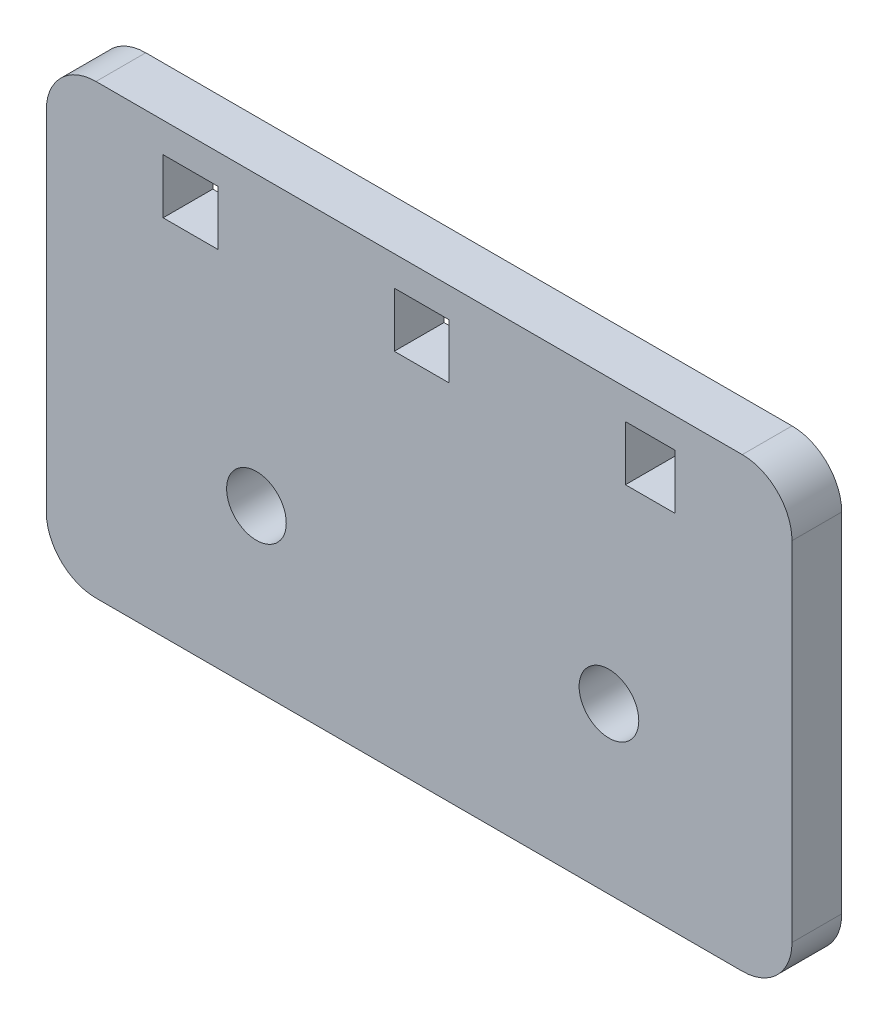
ISO-10303-21;
HEADER;
FILE_DESCRIPTION(('STEP AP214'),'2;1');
FILE_NAME('part.step','',(''),(''),'','','');
FILE_SCHEMA(('AUTOMOTIVE_DESIGN { 1 0 10303 214 1 1 1 1 }'));
ENDSEC;
DATA;
#1=APPLICATION_CONTEXT('core data for automotive mechanical design processes');
#2=APPLICATION_PROTOCOL_DEFINITION('international standard','automotive_design',2000,#1);
#3=PRODUCT_CONTEXT('',#1,'mechanical');
#4=PRODUCT('Part','Part','',(#3));
#5=PRODUCT_RELATED_PRODUCT_CATEGORY('part','',(#4));
#6=PRODUCT_DEFINITION_FORMATION('','',#4);
#7=PRODUCT_DEFINITION_CONTEXT('part definition',#1,'design');
#8=PRODUCT_DEFINITION('design','',#6,#7);
#9=PRODUCT_DEFINITION_SHAPE('','',#8);
#10=(LENGTH_UNIT() NAMED_UNIT(*) SI_UNIT(.MILLI.,.METRE.));
#11=(NAMED_UNIT(*) PLANE_ANGLE_UNIT() SI_UNIT($,.RADIAN.));
#12=(NAMED_UNIT(*) SI_UNIT($,.STERADIAN.) SOLID_ANGLE_UNIT());
#13=UNCERTAINTY_MEASURE_WITH_UNIT(LENGTH_MEASURE(1.E-05),#10,'distance_accuracy_value','');
#14=(GEOMETRIC_REPRESENTATION_CONTEXT(3) GLOBAL_UNCERTAINTY_ASSIGNED_CONTEXT((#13)) GLOBAL_UNIT_ASSIGNED_CONTEXT((#10,
#11,#12)) REPRESENTATION_CONTEXT('',''));
#15=CARTESIAN_POINT('',(0.,0.,0.));
#16=DIRECTION('',(0.,0.,1.));
#17=DIRECTION('',(1.,0.,0.));
#18=AXIS2_PLACEMENT_3D('',#15,#16,#17);
#19=CARTESIAN_POINT('',(0.,0.,5.));
#20=DIRECTION('',(0.,0.,1.));
#21=DIRECTION('',(1.,0.,0.));
#22=AXIS2_PLACEMENT_3D('',#19,#20,#21);
#23=PLANE('',#22);
#24=DIRECTION('',(0.,-1.,0.));
#25=VECTOR('',#24,1.);
#26=CARTESIAN_POINT('',(58.25,0.,5.));
#27=LINE('',#26,#25);
#28=CARTESIAN_POINT('',(58.25,-3.,5.));
#29=VERTEX_POINT('',#28);
#30=CARTESIAN_POINT('',(58.25,-8.49999999999999,5.));
#31=VERTEX_POINT('',#30);
#32=EDGE_CURVE('E186',#29,#31,#27,.T.);
#33=ORIENTED_EDGE('',*,*,#32,.F.);
#34=DIRECTION('',(-1.,0.,0.));
#35=VECTOR('',#34,1.);
#36=CARTESIAN_POINT('',(0.,-3.,5.));
#37=LINE('',#36,#35);
#38=CARTESIAN_POINT('',(63.25,-3.,5.));
#39=VERTEX_POINT('',#38);
#40=EDGE_CURVE('E207',#39,#29,#37,.T.);
#41=ORIENTED_EDGE('',*,*,#40,.F.);
#42=DIRECTION('',(0.,1.,0.));
#43=VECTOR('',#42,1.);
#44=CARTESIAN_POINT('',(63.25,0.,5.));
#45=LINE('',#44,#43);
#46=CARTESIAN_POINT('',(63.25,-8.49999999999999,5.));
#47=VERTEX_POINT('',#46);
#48=EDGE_CURVE('E206',#47,#39,#45,.T.);
#49=ORIENTED_EDGE('',*,*,#48,.F.);
#50=DIRECTION('',(1.,0.,0.));
#51=VECTOR('',#50,1.);
#52=CARTESIAN_POINT('',(0.,-8.50000000000001,5.));
#53=LINE('',#52,#51);
#54=EDGE_CURVE('E213',#31,#47,#53,.T.);
#55=ORIENTED_EDGE('',*,*,#54,.F.);
#56=EDGE_LOOP('',(#33,#41,#49,#55));
#57=FACE_BOUND('',#56,.T.);
#58=DIRECTION('',(0.,1.,0.));
#59=VECTOR('',#58,1.);
#60=CARTESIAN_POINT('',(40.5,0.,5.));
#61=LINE('',#60,#59);
#62=CARTESIAN_POINT('',(40.5,-8.5,5.));
#63=VERTEX_POINT('',#62);
#64=CARTESIAN_POINT('',(40.5,-3.,5.));
#65=VERTEX_POINT('',#64);
#66=EDGE_CURVE('E221',#63,#65,#61,.T.);
#67=ORIENTED_EDGE('',*,*,#66,.F.);
#68=DIRECTION('',(1.,0.,0.));
#69=VECTOR('',#68,1.);
#70=CARTESIAN_POINT('',(0.,-8.49999999999999,5.));
#71=LINE('',#70,#69);
#72=CARTESIAN_POINT('',(35.,-8.5,5.));
#73=VERTEX_POINT('',#72);
#74=EDGE_CURVE('E259',#73,#63,#71,.T.);
#75=ORIENTED_EDGE('',*,*,#74,.F.);
#76=DIRECTION('',(0.,-1.,0.));
#77=VECTOR('',#76,1.);
#78=CARTESIAN_POINT('',(35.,0.,5.));
#79=LINE('',#78,#77);
#80=CARTESIAN_POINT('',(35.,-3.,5.));
#81=VERTEX_POINT('',#80);
#82=EDGE_CURVE('E272',#81,#73,#79,.T.);
#83=ORIENTED_EDGE('',*,*,#82,.F.);
#84=DIRECTION('',(-1.,0.,0.));
#85=VECTOR('',#84,1.);
#86=CARTESIAN_POINT('',(0.,-3.,5.));
#87=LINE('',#86,#85);
#88=EDGE_CURVE('E271',#65,#81,#87,.T.);
#89=ORIENTED_EDGE('',*,*,#88,.F.);
#90=EDGE_LOOP('',(#67,#75,#83,#89));
#91=FACE_BOUND('',#90,.T.);
#92=CARTESIAN_POINT('',(21.1350000104374,-28.9000000045357,5.));
#93=DIRECTION('',(0.,0.,1.));
#94=DIRECTION('',(1.,0.,0.));
#95=AXIS2_PLACEMENT_3D('',#92,#93,#94);
#96=CIRCLE('',#95,3.00000000000001);
#97=CARTESIAN_POINT('',(24.1350000104374,-28.9000000045357,5.));
#98=VERTEX_POINT('',#97);
#99=EDGE_CURVE('E291',#98,#98,#96,.T.);
#100=ORIENTED_EDGE('',*,*,#99,.F.);
#101=EDGE_LOOP('',(#100));
#102=FACE_BOUND('',#101,.T.);
#103=DIRECTION('',(0.,-1.,0.));
#104=VECTOR('',#103,1.);
#105=CARTESIAN_POINT('',(0.,0.,5.));
#106=LINE('',#105,#104);
#107=CARTESIAN_POINT('',(0.,-5.,5.));
#108=VERTEX_POINT('',#107);
#109=CARTESIAN_POINT('',(0.,-40.,5.));
#110=VERTEX_POINT('',#109);
#111=EDGE_CURVE('E297',#108,#110,#106,.T.);
#112=ORIENTED_EDGE('',*,*,#111,.T.);
#113=CARTESIAN_POINT('',(5.00000000000001,-40.,5.));
#114=DIRECTION('',(0.,0.,1.));
#115=DIRECTION('',(1.,0.,0.));
#116=AXIS2_PLACEMENT_3D('',#113,#114,#115);
#117=CIRCLE('',#116,5.);
#118=CARTESIAN_POINT('',(5.00000000000001,-45.,5.));
#119=VERTEX_POINT('',#118);
#120=EDGE_CURVE('E343',#110,#119,#117,.T.);
#121=ORIENTED_EDGE('',*,*,#120,.T.);
#122=DIRECTION('',(1.,0.,0.));
#123=VECTOR('',#122,1.);
#124=CARTESIAN_POINT('',(0.,-45.,5.));
#125=LINE('',#124,#123);
#126=CARTESIAN_POINT('',(70.,-45.,5.));
#127=VERTEX_POINT('',#126);
#128=EDGE_CURVE('E305',#119,#127,#125,.T.);
#129=ORIENTED_EDGE('',*,*,#128,.T.);
#130=CARTESIAN_POINT('',(70.,-40.,5.));
#131=DIRECTION('',(0.,0.,1.));
#132=DIRECTION('',(1.,0.,0.));
#133=AXIS2_PLACEMENT_3D('',#130,#131,#132);
#134=CIRCLE('',#133,5.);
#135=CARTESIAN_POINT('',(75.,-40.,5.));
#136=VERTEX_POINT('',#135);
#137=EDGE_CURVE('E341',#127,#136,#134,.T.);
#138=ORIENTED_EDGE('',*,*,#137,.T.);
#139=DIRECTION('',(0.,1.,0.));
#140=VECTOR('',#139,1.);
#141=CARTESIAN_POINT('',(75.,0.,5.));
#142=LINE('',#141,#140);
#143=CARTESIAN_POINT('',(75.,-5.,5.));
#144=VERTEX_POINT('',#143);
#145=EDGE_CURVE('E310',#136,#144,#142,.T.);
#146=ORIENTED_EDGE('',*,*,#145,.T.);
#147=CARTESIAN_POINT('',(70.,-5.,5.));
#148=DIRECTION('',(0.,0.,1.));
#149=DIRECTION('',(1.,0.,0.));
#150=AXIS2_PLACEMENT_3D('',#147,#148,#149);
#151=CIRCLE('',#150,5.);
#152=CARTESIAN_POINT('',(70.,0.,5.));
#153=VERTEX_POINT('',#152);
#154=EDGE_CURVE('E61',#144,#153,#151,.T.);
#155=ORIENTED_EDGE('',*,*,#154,.T.);
#156=DIRECTION('',(-1.,0.,0.));
#157=VECTOR('',#156,1.);
#158=CARTESIAN_POINT('',(0.,0.,5.));
#159=LINE('',#158,#157);
#160=CARTESIAN_POINT('',(5.,0.,5.));
#161=VERTEX_POINT('',#160);
#162=EDGE_CURVE('E309',#153,#161,#159,.T.);
#163=ORIENTED_EDGE('',*,*,#162,.T.);
#164=CARTESIAN_POINT('',(5.,-5.,5.));
#165=DIRECTION('',(0.,0.,1.));
#166=DIRECTION('',(1.,0.,0.));
#167=AXIS2_PLACEMENT_3D('',#164,#165,#166);
#168=CIRCLE('',#167,5.);
#169=EDGE_CURVE('E336',#161,#108,#168,.T.);
#170=ORIENTED_EDGE('',*,*,#169,.T.);
#171=EDGE_LOOP('',(#112,#121,#129,#138,#146,#155,#163,#170));
#172=FACE_BOUND('',#171,.T.);
#173=CARTESIAN_POINT('',(56.5900000000001,-28.3999999999999,5.));
#174=DIRECTION('',(0.,0.,1.));
#175=DIRECTION('',(1.,0.,0.));
#176=AXIS2_PLACEMENT_3D('',#173,#174,#175);
#177=CIRCLE('',#176,3.00000000001641);
#178=CARTESIAN_POINT('',(59.5900000000165,-28.3999999999999,5.));
#179=VERTEX_POINT('',#178);
#180=EDGE_CURVE('E289',#179,#179,#177,.T.);
#181=ORIENTED_EDGE('',*,*,#180,.F.);
#182=EDGE_LOOP('',(#181));
#183=FACE_BOUND('',#182,.T.);
#184=DIRECTION('',(0.,-1.,0.));
#185=VECTOR('',#184,1.);
#186=CARTESIAN_POINT('',(17.25,0.,5.));
#187=LINE('',#186,#185);
#188=CARTESIAN_POINT('',(17.25,-3.,5.));
#189=VERTEX_POINT('',#188);
#190=CARTESIAN_POINT('',(17.25,-8.5,5.));
#191=VERTEX_POINT('',#190);
#192=EDGE_CURVE('E238',#189,#191,#187,.T.);
#193=ORIENTED_EDGE('',*,*,#192,.T.);
#194=DIRECTION('',(-1.,0.,0.));
#195=VECTOR('',#194,1.);
#196=CARTESIAN_POINT('',(0.,-8.5,5.));
#197=LINE('',#196,#195);
#198=CARTESIAN_POINT('',(11.75,-8.5,5.));
#199=VERTEX_POINT('',#198);
#200=EDGE_CURVE('E240',#191,#199,#197,.T.);
#201=ORIENTED_EDGE('',*,*,#200,.T.);
#202=DIRECTION('',(0.,1.,0.));
#203=VECTOR('',#202,1.);
#204=CARTESIAN_POINT('',(11.75,0.,5.));
#205=LINE('',#204,#203);
#206=CARTESIAN_POINT('',(11.75,-3.,5.));
#207=VERTEX_POINT('',#206);
#208=EDGE_CURVE('E228',#199,#207,#205,.T.);
#209=ORIENTED_EDGE('',*,*,#208,.T.);
#210=DIRECTION('',(1.,0.,0.));
#211=VECTOR('',#210,1.);
#212=CARTESIAN_POINT('',(0.,-3.,5.));
#213=LINE('',#212,#211);
#214=EDGE_CURVE('E244',#207,#189,#213,.T.);
#215=ORIENTED_EDGE('',*,*,#214,.T.);
#216=EDGE_LOOP('',(#193,#201,#209,#215));
#217=FACE_BOUND('',#216,.T.);
#218=ADVANCED_FACE('F43',(#57,#91,#102,#172,#183,#217),#23,.T.);
#219=CARTESIAN_POINT('',(0.,0.,0.));
#220=DIRECTION('',(0.,0.,1.));
#221=DIRECTION('',(1.,0.,0.));
#222=AXIS2_PLACEMENT_3D('',#219,#220,#221);
#223=PLANE('',#222);
#224=CARTESIAN_POINT('',(56.5900000000001,-28.3999999999999,0.));
#225=DIRECTION('',(0.,0.,1.));
#226=DIRECTION('',(1.,0.,0.));
#227=AXIS2_PLACEMENT_3D('',#224,#225,#226);
#228=CIRCLE('',#227,3.00000000001641);
#229=CARTESIAN_POINT('',(59.5900000000165,-28.3999999999999,0.));
#230=VERTEX_POINT('',#229);
#231=EDGE_CURVE('E282',#230,#230,#228,.T.);
#232=ORIENTED_EDGE('',*,*,#231,.T.);
#233=EDGE_LOOP('',(#232));
#234=FACE_BOUND('',#233,.T.);
#235=CARTESIAN_POINT('',(21.1350000104374,-28.9000000045357,0.));
#236=DIRECTION('',(0.,0.,1.));
#237=DIRECTION('',(1.,0.,0.));
#238=AXIS2_PLACEMENT_3D('',#235,#236,#237);
#239=CIRCLE('',#238,3.00000000000001);
#240=CARTESIAN_POINT('',(24.1350000104374,-28.9000000045357,0.));
#241=VERTEX_POINT('',#240);
#242=EDGE_CURVE('E292',#241,#241,#239,.T.);
#243=ORIENTED_EDGE('',*,*,#242,.T.);
#244=EDGE_LOOP('',(#243));
#245=FACE_BOUND('',#244,.T.);
#246=DIRECTION('',(1.,0.,0.));
#247=VECTOR('',#246,1.);
#248=CARTESIAN_POINT('',(0.,-45.,0.));
#249=LINE('',#248,#247);
#250=CARTESIAN_POINT('',(5.00000000000001,-45.,0.));
#251=VERTEX_POINT('',#250);
#252=CARTESIAN_POINT('',(70.,-45.,0.));
#253=VERTEX_POINT('',#252);
#254=EDGE_CURVE('E311',#251,#253,#249,.T.);
#255=ORIENTED_EDGE('',*,*,#254,.F.);
#256=CARTESIAN_POINT('',(5.00000000000001,-40.,0.));
#257=DIRECTION('',(0.,0.,1.));
#258=DIRECTION('',(1.,0.,0.));
#259=AXIS2_PLACEMENT_3D('',#256,#257,#258);
#260=CIRCLE('',#259,5.);
#261=CARTESIAN_POINT('',(0.,-40.,0.));
#262=VERTEX_POINT('',#261);
#263=EDGE_CURVE('E333',#251,#262,#260,.F.);
#264=ORIENTED_EDGE('',*,*,#263,.T.);
#265=DIRECTION('',(0.,-1.,0.));
#266=VECTOR('',#265,1.);
#267=CARTESIAN_POINT('',(0.,0.,0.));
#268=LINE('',#267,#266);
#269=CARTESIAN_POINT('',(0.,-5.,0.));
#270=VERTEX_POINT('',#269);
#271=EDGE_CURVE('E296',#270,#262,#268,.T.);
#272=ORIENTED_EDGE('',*,*,#271,.F.);
#273=CARTESIAN_POINT('',(5.,-5.,0.));
#274=DIRECTION('',(0.,0.,1.));
#275=DIRECTION('',(1.,0.,0.));
#276=AXIS2_PLACEMENT_3D('',#273,#274,#275);
#277=CIRCLE('',#276,5.);
#278=CARTESIAN_POINT('',(5.,0.,0.));
#279=VERTEX_POINT('',#278);
#280=EDGE_CURVE('E322',#270,#279,#277,.F.);
#281=ORIENTED_EDGE('',*,*,#280,.T.);
#282=DIRECTION('',(-1.,0.,0.));
#283=VECTOR('',#282,1.);
#284=CARTESIAN_POINT('',(0.,0.,0.));
#285=LINE('',#284,#283);
#286=CARTESIAN_POINT('',(70.,0.,0.));
#287=VERTEX_POINT('',#286);
#288=EDGE_CURVE('E303',#287,#279,#285,.T.);
#289=ORIENTED_EDGE('',*,*,#288,.F.);
#290=CARTESIAN_POINT('',(70.,-5.,0.));
#291=DIRECTION('',(0.,0.,1.));
#292=DIRECTION('',(1.,0.,0.));
#293=AXIS2_PLACEMENT_3D('',#290,#291,#292);
#294=CIRCLE('',#293,5.);
#295=CARTESIAN_POINT('',(75.,-5.,0.));
#296=VERTEX_POINT('',#295);
#297=EDGE_CURVE('E326',#287,#296,#294,.F.);
#298=ORIENTED_EDGE('',*,*,#297,.T.);
#299=DIRECTION('',(0.,1.,0.));
#300=VECTOR('',#299,1.);
#301=CARTESIAN_POINT('',(75.,0.,0.));
#302=LINE('',#301,#300);
#303=CARTESIAN_POINT('',(75.,-40.,0.));
#304=VERTEX_POINT('',#303);
#305=EDGE_CURVE('E320',#304,#296,#302,.T.);
#306=ORIENTED_EDGE('',*,*,#305,.F.);
#307=CARTESIAN_POINT('',(70.,-40.,0.));
#308=DIRECTION('',(0.,0.,1.));
#309=DIRECTION('',(1.,0.,0.));
#310=AXIS2_PLACEMENT_3D('',#307,#308,#309);
#311=CIRCLE('',#310,5.);
#312=EDGE_CURVE('E328',#304,#253,#311,.F.);
#313=ORIENTED_EDGE('',*,*,#312,.T.);
#314=EDGE_LOOP('',(#255,#264,#272,#281,#289,#298,#306,#313));
#315=FACE_BOUND('',#314,.T.);
#316=DIRECTION('',(1.,0.,0.));
#317=VECTOR('',#316,1.);
#318=CARTESIAN_POINT('',(0.,-8.49999999999999,0.));
#319=LINE('',#318,#317);
#320=CARTESIAN_POINT('',(35.,-8.5,0.));
#321=VERTEX_POINT('',#320);
#322=CARTESIAN_POINT('',(40.5,-8.5,0.));
#323=VERTEX_POINT('',#322);
#324=EDGE_CURVE('E266',#321,#323,#319,.T.);
#325=ORIENTED_EDGE('',*,*,#324,.T.);
#326=DIRECTION('',(0.,1.,0.));
#327=VECTOR('',#326,1.);
#328=CARTESIAN_POINT('',(40.5,0.,0.));
#329=LINE('',#328,#327);
#330=CARTESIAN_POINT('',(40.5,-3.,0.));
#331=VERTEX_POINT('',#330);
#332=EDGE_CURVE('E258',#323,#331,#329,.T.);
#333=ORIENTED_EDGE('',*,*,#332,.T.);
#334=DIRECTION('',(-1.,0.,0.));
#335=VECTOR('',#334,1.);
#336=CARTESIAN_POINT('',(0.,-3.,0.));
#337=LINE('',#336,#335);
#338=CARTESIAN_POINT('',(35.,-3.,0.));
#339=VERTEX_POINT('',#338);
#340=EDGE_CURVE('E260',#331,#339,#337,.T.);
#341=ORIENTED_EDGE('',*,*,#340,.T.);
#342=DIRECTION('',(0.,-1.,0.));
#343=VECTOR('',#342,1.);
#344=CARTESIAN_POINT('',(35.,0.,0.));
#345=LINE('',#344,#343);
#346=EDGE_CURVE('E261',#339,#321,#345,.T.);
#347=ORIENTED_EDGE('',*,*,#346,.T.);
#348=EDGE_LOOP('',(#325,#333,#341,#347));
#349=FACE_BOUND('',#348,.T.);
#350=DIRECTION('',(-1.,0.,0.));
#351=VECTOR('',#350,1.);
#352=CARTESIAN_POINT('',(0.,-3.,0.));
#353=LINE('',#352,#351);
#354=CARTESIAN_POINT('',(63.25,-3.,0.));
#355=VERTEX_POINT('',#354);
#356=CARTESIAN_POINT('',(58.25,-3.,0.));
#357=VERTEX_POINT('',#356);
#358=EDGE_CURVE('E193',#355,#357,#353,.T.);
#359=ORIENTED_EDGE('',*,*,#358,.T.);
#360=DIRECTION('',(0.,-1.,0.));
#361=VECTOR('',#360,1.);
#362=CARTESIAN_POINT('',(58.25,0.,0.));
#363=LINE('',#362,#361);
#364=CARTESIAN_POINT('',(58.25,-8.49999999999999,0.));
#365=VERTEX_POINT('',#364);
#366=EDGE_CURVE('E184',#357,#365,#363,.T.);
#367=ORIENTED_EDGE('',*,*,#366,.T.);
#368=DIRECTION('',(1.,0.,0.));
#369=VECTOR('',#368,1.);
#370=CARTESIAN_POINT('',(0.,-8.50000000000001,0.));
#371=LINE('',#370,#369);
#372=CARTESIAN_POINT('',(63.25,-8.49999999999999,0.));
#373=VERTEX_POINT('',#372);
#374=EDGE_CURVE('E200',#365,#373,#371,.T.);
#375=ORIENTED_EDGE('',*,*,#374,.T.);
#376=DIRECTION('',(0.,1.,0.));
#377=VECTOR('',#376,1.);
#378=CARTESIAN_POINT('',(63.25,0.,0.));
#379=LINE('',#378,#377);
#380=EDGE_CURVE('E201',#373,#355,#379,.T.);
#381=ORIENTED_EDGE('',*,*,#380,.T.);
#382=EDGE_LOOP('',(#359,#367,#375,#381));
#383=FACE_BOUND('',#382,.T.);
#384=DIRECTION('',(-1.,0.,0.));
#385=VECTOR('',#384,1.);
#386=CARTESIAN_POINT('',(0.,-8.5,0.));
#387=LINE('',#386,#385);
#388=CARTESIAN_POINT('',(17.25,-8.5,0.));
#389=VERTEX_POINT('',#388);
#390=CARTESIAN_POINT('',(11.75,-8.5,0.));
#391=VERTEX_POINT('',#390);
#392=EDGE_CURVE('E229',#389,#391,#387,.T.);
#393=ORIENTED_EDGE('',*,*,#392,.F.);
#394=DIRECTION('',(0.,-1.,0.));
#395=VECTOR('',#394,1.);
#396=CARTESIAN_POINT('',(17.25,0.,0.));
#397=LINE('',#396,#395);
#398=CARTESIAN_POINT('',(17.25,-3.,0.));
#399=VERTEX_POINT('',#398);
#400=EDGE_CURVE('E230',#399,#389,#397,.T.);
#401=ORIENTED_EDGE('',*,*,#400,.F.);
#402=DIRECTION('',(1.,0.,0.));
#403=VECTOR('',#402,1.);
#404=CARTESIAN_POINT('',(0.,-3.,0.));
#405=LINE('',#404,#403);
#406=CARTESIAN_POINT('',(11.75,-3.,0.));
#407=VERTEX_POINT('',#406);
#408=EDGE_CURVE('E232',#407,#399,#405,.T.);
#409=ORIENTED_EDGE('',*,*,#408,.F.);
#410=DIRECTION('',(0.,1.,0.));
#411=VECTOR('',#410,1.);
#412=CARTESIAN_POINT('',(11.75,0.,0.));
#413=LINE('',#412,#411);
#414=EDGE_CURVE('E234',#391,#407,#413,.T.);
#415=ORIENTED_EDGE('',*,*,#414,.F.);
#416=EDGE_LOOP('',(#393,#401,#409,#415));
#417=FACE_BOUND('',#416,.T.);
#418=ADVANCED_FACE('F202',(#234,#245,#315,#349,#383,#417),#223,.F.);
#419=CARTESIAN_POINT('',(0.,0.,5.));
#420=DIRECTION('',(1.,0.,0.));
#421=DIRECTION('',(0.,1.,0.));
#422=AXIS2_PLACEMENT_3D('',#419,#420,#421);
#423=PLANE('',#422);
#424=ORIENTED_EDGE('',*,*,#271,.T.);
#425=DIRECTION('',(0.,0.,-1.));
#426=VECTOR('',#425,1.);
#427=CARTESIAN_POINT('',(0.,-40.,5.));
#428=LINE('',#427,#426);
#429=EDGE_CURVE('E338',#262,#110,#428,.F.);
#430=ORIENTED_EDGE('',*,*,#429,.T.);
#431=ORIENTED_EDGE('',*,*,#111,.F.);
#432=DIRECTION('',(0.,0.,-1.));
#433=VECTOR('',#432,1.);
#434=CARTESIAN_POINT('',(0.,-5.,5.));
#435=LINE('',#434,#433);
#436=EDGE_CURVE('E331',#108,#270,#435,.T.);
#437=ORIENTED_EDGE('',*,*,#436,.T.);
#438=EDGE_LOOP('',(#424,#430,#431,#437));
#439=FACE_BOUND('',#438,.T.);
#440=ADVANCED_FACE('F371',(#439),#423,.F.);
#441=CARTESIAN_POINT('',(0.,-45.,5.));
#442=DIRECTION('',(0.,1.,0.));
#443=DIRECTION('',(0.,0.,1.));
#444=AXIS2_PLACEMENT_3D('',#441,#442,#443);
#445=PLANE('',#444);
#446=ORIENTED_EDGE('',*,*,#128,.F.);
#447=DIRECTION('',(0.,0.,-1.));
#448=VECTOR('',#447,1.);
#449=CARTESIAN_POINT('',(5.00000000000001,-45.,5.));
#450=LINE('',#449,#448);
#451=EDGE_CURVE('E321',#119,#251,#450,.T.);
#452=ORIENTED_EDGE('',*,*,#451,.T.);
#453=ORIENTED_EDGE('',*,*,#254,.T.);
#454=DIRECTION('',(0.,0.,-1.));
#455=VECTOR('',#454,1.);
#456=CARTESIAN_POINT('',(70.,-45.,5.));
#457=LINE('',#456,#455);
#458=EDGE_CURVE('E312',#253,#127,#457,.F.);
#459=ORIENTED_EDGE('',*,*,#458,.T.);
#460=EDGE_LOOP('',(#446,#452,#453,#459));
#461=FACE_BOUND('',#460,.T.);
#462=ADVANCED_FACE('F377',(#461),#445,.F.);
#463=CARTESIAN_POINT('',(75.,0.,5.));
#464=DIRECTION('',(-1.,0.,0.));
#465=DIRECTION('',(0.,0.,1.));
#466=AXIS2_PLACEMENT_3D('',#463,#464,#465);
#467=PLANE('',#466);
#468=ORIENTED_EDGE('',*,*,#145,.F.);
#469=DIRECTION('',(0.,0.,-1.));
#470=VECTOR('',#469,1.);
#471=CARTESIAN_POINT('',(75.,-40.,5.));
#472=LINE('',#471,#470);
#473=EDGE_CURVE('E350',#136,#304,#472,.T.);
#474=ORIENTED_EDGE('',*,*,#473,.T.);
#475=ORIENTED_EDGE('',*,*,#305,.T.);
#476=DIRECTION('',(0.,0.,-1.));
#477=VECTOR('',#476,1.);
#478=CARTESIAN_POINT('',(75.,-5.,5.));
#479=LINE('',#478,#477);
#480=EDGE_CURVE('E344',#296,#144,#479,.F.);
#481=ORIENTED_EDGE('',*,*,#480,.T.);
#482=EDGE_LOOP('',(#468,#474,#475,#481));
#483=FACE_BOUND('',#482,.T.);
#484=ADVANCED_FACE('F352',(#483),#467,.F.);
#485=CARTESIAN_POINT('',(0.,0.,5.));
#486=DIRECTION('',(0.,-1.,0.));
#487=DIRECTION('',(0.,0.,-1.));
#488=AXIS2_PLACEMENT_3D('',#485,#486,#487);
#489=PLANE('',#488);
#490=ORIENTED_EDGE('',*,*,#162,.F.);
#491=DIRECTION('',(0.,0.,-1.));
#492=VECTOR('',#491,1.);
#493=CARTESIAN_POINT('',(70.,0.,5.));
#494=LINE('',#493,#492);
#495=EDGE_CURVE('E11',#153,#287,#494,.T.);
#496=ORIENTED_EDGE('',*,*,#495,.T.);
#497=ORIENTED_EDGE('',*,*,#288,.T.);
#498=DIRECTION('',(0.,0.,-1.));
#499=VECTOR('',#498,1.);
#500=CARTESIAN_POINT('',(5.,0.,5.));
#501=LINE('',#500,#499);
#502=EDGE_CURVE('E51',#279,#161,#501,.F.);
#503=ORIENTED_EDGE('',*,*,#502,.T.);
#504=EDGE_LOOP('',(#490,#496,#497,#503));
#505=FACE_BOUND('',#504,.T.);
#506=ADVANCED_FACE('F361',(#505),#489,.F.);
#507=CARTESIAN_POINT('',(21.1350000104374,-28.9000000045357,5.));
#508=DIRECTION('',(0.,0.,-1.));
#509=DIRECTION('',(-1.,0.,0.));
#510=AXIS2_PLACEMENT_3D('',#507,#508,#509);
#511=CYLINDRICAL_SURFACE('',#510,3.00000000000001);
#512=ORIENTED_EDGE('',*,*,#99,.T.);
#513=EDGE_LOOP('',(#512));
#514=FACE_BOUND('',#513,.T.);
#515=ORIENTED_EDGE('',*,*,#242,.F.);
#516=EDGE_LOOP('',(#515));
#517=FACE_BOUND('',#516,.T.);
#518=ADVANCED_FACE('F405',(#514,#517),#511,.F.);
#519=CARTESIAN_POINT('',(56.5900000000001,-28.3999999999999,5.));
#520=DIRECTION('',(0.,0.,-1.));
#521=DIRECTION('',(-1.,0.,0.));
#522=AXIS2_PLACEMENT_3D('',#519,#520,#521);
#523=CYLINDRICAL_SURFACE('',#522,3.00000000001641);
#524=ORIENTED_EDGE('',*,*,#180,.T.);
#525=EDGE_LOOP('',(#524));
#526=FACE_BOUND('',#525,.T.);
#527=ORIENTED_EDGE('',*,*,#231,.F.);
#528=EDGE_LOOP('',(#527));
#529=FACE_BOUND('',#528,.T.);
#530=ADVANCED_FACE('F568',(#526,#529),#523,.F.);
#531=CARTESIAN_POINT('',(40.5,0.,0.));
#532=DIRECTION('',(1.,0.,0.));
#533=DIRECTION('',(0.,0.,-1.));
#534=AXIS2_PLACEMENT_3D('',#531,#532,#533);
#535=PLANE('',#534);
#536=ORIENTED_EDGE('',*,*,#66,.T.);
#537=DIRECTION('',(0.,0.,1.));
#538=VECTOR('',#537,1.);
#539=CARTESIAN_POINT('',(40.5,-3.,0.));
#540=LINE('',#539,#538);
#541=EDGE_CURVE('E267',#331,#65,#540,.T.);
#542=ORIENTED_EDGE('',*,*,#541,.F.);
#543=ORIENTED_EDGE('',*,*,#332,.F.);
#544=DIRECTION('',(0.,0.,1.));
#545=VECTOR('',#544,1.);
#546=CARTESIAN_POINT('',(40.5,-8.5,0.));
#547=LINE('',#546,#545);
#548=EDGE_CURVE('E278',#323,#63,#547,.T.);
#549=ORIENTED_EDGE('',*,*,#548,.T.);
#550=EDGE_LOOP('',(#536,#542,#543,#549));
#551=FACE_BOUND('',#550,.T.);
#552=ADVANCED_FACE('F560',(#551),#535,.F.);
#553=CARTESIAN_POINT('',(0.,-8.49999999999999,0.));
#554=DIRECTION('',(0.,-1.,0.));
#555=DIRECTION('',(1.,0.,0.));
#556=AXIS2_PLACEMENT_3D('',#553,#554,#555);
#557=PLANE('',#556);
#558=ORIENTED_EDGE('',*,*,#74,.T.);
#559=ORIENTED_EDGE('',*,*,#548,.F.);
#560=ORIENTED_EDGE('',*,*,#324,.F.);
#561=DIRECTION('',(0.,0.,1.));
#562=VECTOR('',#561,1.);
#563=CARTESIAN_POINT('',(35.,-8.5,0.));
#564=LINE('',#563,#562);
#565=EDGE_CURVE('E285',#321,#73,#564,.T.);
#566=ORIENTED_EDGE('',*,*,#565,.T.);
#567=EDGE_LOOP('',(#558,#559,#560,#566));
#568=FACE_BOUND('',#567,.T.);
#569=ADVANCED_FACE('F547',(#568),#557,.F.);
#570=CARTESIAN_POINT('',(35.,0.,0.));
#571=DIRECTION('',(-1.,0.,0.));
#572=DIRECTION('',(0.,0.,1.));
#573=AXIS2_PLACEMENT_3D('',#570,#571,#572);
#574=PLANE('',#573);
#575=ORIENTED_EDGE('',*,*,#82,.T.);
#576=ORIENTED_EDGE('',*,*,#565,.F.);
#577=ORIENTED_EDGE('',*,*,#346,.F.);
#578=DIRECTION('',(0.,0.,1.));
#579=VECTOR('',#578,1.);
#580=CARTESIAN_POINT('',(35.,-3.,0.));
#581=LINE('',#580,#579);
#582=EDGE_CURVE('E281',#339,#81,#581,.T.);
#583=ORIENTED_EDGE('',*,*,#582,.T.);
#584=EDGE_LOOP('',(#575,#576,#577,#583));
#585=FACE_BOUND('',#584,.T.);
#586=ADVANCED_FACE('F538',(#585),#574,.F.);
#587=CARTESIAN_POINT('',(0.,-3.,0.));
#588=DIRECTION('',(0.,1.,0.));
#589=DIRECTION('',(0.,0.,1.));
#590=AXIS2_PLACEMENT_3D('',#587,#588,#589);
#591=PLANE('',#590);
#592=ORIENTED_EDGE('',*,*,#88,.T.);
#593=ORIENTED_EDGE('',*,*,#582,.F.);
#594=ORIENTED_EDGE('',*,*,#340,.F.);
#595=ORIENTED_EDGE('',*,*,#541,.T.);
#596=EDGE_LOOP('',(#592,#593,#594,#595));
#597=FACE_BOUND('',#596,.T.);
#598=ADVANCED_FACE('F532',(#597),#591,.F.);
#599=CARTESIAN_POINT('',(58.25,0.,0.));
#600=DIRECTION('',(-1.,0.,0.));
#601=DIRECTION('',(0.,0.,1.));
#602=AXIS2_PLACEMENT_3D('',#599,#600,#601);
#603=PLANE('',#602);
#604=ORIENTED_EDGE('',*,*,#32,.T.);
#605=DIRECTION('',(0.,0.,1.));
#606=VECTOR('',#605,1.);
#607=CARTESIAN_POINT('',(58.25,-8.49999999999999,0.));
#608=LINE('',#607,#606);
#609=EDGE_CURVE('E183',#365,#31,#608,.T.);
#610=ORIENTED_EDGE('',*,*,#609,.F.);
#611=ORIENTED_EDGE('',*,*,#366,.F.);
#612=DIRECTION('',(0.,0.,1.));
#613=VECTOR('',#612,1.);
#614=CARTESIAN_POINT('',(58.25,-3.,0.));
#615=LINE('',#614,#613);
#616=EDGE_CURVE('E218',#357,#29,#615,.T.);
#617=ORIENTED_EDGE('',*,*,#616,.T.);
#618=EDGE_LOOP('',(#604,#610,#611,#617));
#619=FACE_BOUND('',#618,.T.);
#620=ADVANCED_FACE('F181',(#619),#603,.F.);
#621=CARTESIAN_POINT('',(0.,-3.,0.));
#622=DIRECTION('',(0.,1.,0.));
#623=DIRECTION('',(0.,0.,1.));
#624=AXIS2_PLACEMENT_3D('',#621,#622,#623);
#625=PLANE('',#624);
#626=ORIENTED_EDGE('',*,*,#40,.T.);
#627=ORIENTED_EDGE('',*,*,#616,.F.);
#628=ORIENTED_EDGE('',*,*,#358,.F.);
#629=DIRECTION('',(0.,0.,1.));
#630=VECTOR('',#629,1.);
#631=CARTESIAN_POINT('',(63.25,-3.,0.));
#632=LINE('',#631,#630);
#633=EDGE_CURVE('E225',#355,#39,#632,.T.);
#634=ORIENTED_EDGE('',*,*,#633,.T.);
#635=EDGE_LOOP('',(#626,#627,#628,#634));
#636=FACE_BOUND('',#635,.T.);
#637=ADVANCED_FACE('F515',(#636),#625,.F.);
#638=CARTESIAN_POINT('',(63.25,0.,0.));
#639=DIRECTION('',(1.,0.,0.));
#640=DIRECTION('',(0.,0.,-1.));
#641=AXIS2_PLACEMENT_3D('',#638,#639,#640);
#642=PLANE('',#641);
#643=ORIENTED_EDGE('',*,*,#48,.T.);
#644=ORIENTED_EDGE('',*,*,#633,.F.);
#645=ORIENTED_EDGE('',*,*,#380,.F.);
#646=DIRECTION('',(0.,0.,1.));
#647=VECTOR('',#646,1.);
#648=CARTESIAN_POINT('',(63.25,-8.49999999999999,0.));
#649=LINE('',#648,#647);
#650=EDGE_CURVE('E195',#373,#47,#649,.T.);
#651=ORIENTED_EDGE('',*,*,#650,.T.);
#652=EDGE_LOOP('',(#643,#644,#645,#651));
#653=FACE_BOUND('',#652,.T.);
#654=ADVANCED_FACE('F502',(#653),#642,.F.);
#655=CARTESIAN_POINT('',(0.,-8.50000000000001,0.));
#656=DIRECTION('',(0.,-1.,0.));
#657=DIRECTION('',(1.,0.,0.));
#658=AXIS2_PLACEMENT_3D('',#655,#656,#657);
#659=PLANE('',#658);
#660=ORIENTED_EDGE('',*,*,#54,.T.);
#661=ORIENTED_EDGE('',*,*,#650,.F.);
#662=ORIENTED_EDGE('',*,*,#374,.F.);
#663=ORIENTED_EDGE('',*,*,#609,.T.);
#664=EDGE_LOOP('',(#660,#661,#662,#663));
#665=FACE_BOUND('',#664,.T.);
#666=ADVANCED_FACE('F198',(#665),#659,.F.);
#667=CARTESIAN_POINT('',(0.,-8.5,0.));
#668=DIRECTION('',(0.,1.,0.));
#669=DIRECTION('',(0.,0.,1.));
#670=AXIS2_PLACEMENT_3D('',#667,#668,#669);
#671=PLANE('',#670);
#672=ORIENTED_EDGE('',*,*,#200,.F.);
#673=DIRECTION('',(0.,0.,1.));
#674=VECTOR('',#673,1.);
#675=CARTESIAN_POINT('',(17.25,-8.5,0.));
#676=LINE('',#675,#674);
#677=EDGE_CURVE('E237',#389,#191,#676,.T.);
#678=ORIENTED_EDGE('',*,*,#677,.F.);
#679=ORIENTED_EDGE('',*,*,#392,.T.);
#680=DIRECTION('',(0.,0.,1.));
#681=VECTOR('',#680,1.);
#682=CARTESIAN_POINT('',(11.75,-8.5,0.));
#683=LINE('',#682,#681);
#684=EDGE_CURVE('E217',#391,#199,#683,.T.);
#685=ORIENTED_EDGE('',*,*,#684,.T.);
#686=EDGE_LOOP('',(#672,#678,#679,#685));
#687=FACE_BOUND('',#686,.T.);
#688=ADVANCED_FACE('F485',(#687),#671,.T.);
#689=CARTESIAN_POINT('',(11.75,0.,0.));
#690=DIRECTION('',(1.,0.,0.));
#691=DIRECTION('',(0.,0.,-1.));
#692=AXIS2_PLACEMENT_3D('',#689,#690,#691);
#693=PLANE('',#692);
#694=ORIENTED_EDGE('',*,*,#208,.F.);
#695=ORIENTED_EDGE('',*,*,#684,.F.);
#696=ORIENTED_EDGE('',*,*,#414,.T.);
#697=DIRECTION('',(0.,0.,1.));
#698=VECTOR('',#697,1.);
#699=CARTESIAN_POINT('',(11.75,-3.,0.));
#700=LINE('',#699,#698);
#701=EDGE_CURVE('E247',#407,#207,#700,.T.);
#702=ORIENTED_EDGE('',*,*,#701,.T.);
#703=EDGE_LOOP('',(#694,#695,#696,#702));
#704=FACE_BOUND('',#703,.T.);
#705=ADVANCED_FACE('F473',(#704),#693,.T.);
#706=CARTESIAN_POINT('',(0.,-3.,0.));
#707=DIRECTION('',(0.,-1.,0.));
#708=DIRECTION('',(0.,0.,-1.));
#709=AXIS2_PLACEMENT_3D('',#706,#707,#708);
#710=PLANE('',#709);
#711=ORIENTED_EDGE('',*,*,#214,.F.);
#712=ORIENTED_EDGE('',*,*,#701,.F.);
#713=ORIENTED_EDGE('',*,*,#408,.T.);
#714=DIRECTION('',(0.,0.,1.));
#715=VECTOR('',#714,1.);
#716=CARTESIAN_POINT('',(17.25,-3.,0.));
#717=LINE('',#716,#715);
#718=EDGE_CURVE('E251',#399,#189,#717,.T.);
#719=ORIENTED_EDGE('',*,*,#718,.T.);
#720=EDGE_LOOP('',(#711,#712,#713,#719));
#721=FACE_BOUND('',#720,.T.);
#722=ADVANCED_FACE('F461',(#721),#710,.T.);
#723=CARTESIAN_POINT('',(17.25,0.,0.));
#724=DIRECTION('',(-1.,0.,0.));
#725=DIRECTION('',(0.,0.,1.));
#726=AXIS2_PLACEMENT_3D('',#723,#724,#725);
#727=PLANE('',#726);
#728=ORIENTED_EDGE('',*,*,#192,.F.);
#729=ORIENTED_EDGE('',*,*,#718,.F.);
#730=ORIENTED_EDGE('',*,*,#400,.T.);
#731=ORIENTED_EDGE('',*,*,#677,.T.);
#732=EDGE_LOOP('',(#728,#729,#730,#731));
#733=FACE_BOUND('',#732,.T.);
#734=ADVANCED_FACE('F386',(#733),#727,.T.);
#735=CARTESIAN_POINT('',(5.00000000000001,-40.,5.));
#736=DIRECTION('',(0.,0.,-1.));
#737=DIRECTION('',(-1.,0.,0.));
#738=AXIS2_PLACEMENT_3D('',#735,#736,#737);
#739=CYLINDRICAL_SURFACE('',#738,5.);
#740=ORIENTED_EDGE('',*,*,#120,.F.);
#741=ORIENTED_EDGE('',*,*,#429,.F.);
#742=ORIENTED_EDGE('',*,*,#263,.F.);
#743=ORIENTED_EDGE('',*,*,#451,.F.);
#744=EDGE_LOOP('',(#740,#741,#742,#743));
#745=FACE_BOUND('',#744,.T.);
#746=ADVANCED_FACE('F376',(#745),#739,.T.);
#747=CARTESIAN_POINT('',(70.,-40.,5.));
#748=DIRECTION('',(0.,0.,-1.));
#749=DIRECTION('',(-1.,0.,0.));
#750=AXIS2_PLACEMENT_3D('',#747,#748,#749);
#751=CYLINDRICAL_SURFACE('',#750,5.);
#752=ORIENTED_EDGE('',*,*,#137,.F.);
#753=ORIENTED_EDGE('',*,*,#458,.F.);
#754=ORIENTED_EDGE('',*,*,#312,.F.);
#755=ORIENTED_EDGE('',*,*,#473,.F.);
#756=EDGE_LOOP('',(#752,#753,#754,#755));
#757=FACE_BOUND('',#756,.T.);
#758=ADVANCED_FACE('F385',(#757),#751,.T.);
#759=CARTESIAN_POINT('',(70.,-5.,5.));
#760=DIRECTION('',(0.,0.,-1.));
#761=DIRECTION('',(-1.,0.,0.));
#762=AXIS2_PLACEMENT_3D('',#759,#760,#761);
#763=CYLINDRICAL_SURFACE('',#762,5.);
#764=ORIENTED_EDGE('',*,*,#154,.F.);
#765=ORIENTED_EDGE('',*,*,#480,.F.);
#766=ORIENTED_EDGE('',*,*,#297,.F.);
#767=ORIENTED_EDGE('',*,*,#495,.F.);
#768=EDGE_LOOP('',(#764,#765,#766,#767));
#769=FACE_BOUND('',#768,.T.);
#770=ADVANCED_FACE('F364',(#769),#763,.T.);
#771=CARTESIAN_POINT('',(5.,-5.,5.));
#772=DIRECTION('',(0.,0.,-1.));
#773=DIRECTION('',(-1.,0.,0.));
#774=AXIS2_PLACEMENT_3D('',#771,#772,#773);
#775=CYLINDRICAL_SURFACE('',#774,5.);
#776=ORIENTED_EDGE('',*,*,#169,.F.);
#777=ORIENTED_EDGE('',*,*,#502,.F.);
#778=ORIENTED_EDGE('',*,*,#280,.F.);
#779=ORIENTED_EDGE('',*,*,#436,.F.);
#780=EDGE_LOOP('',(#776,#777,#778,#779));
#781=FACE_BOUND('',#780,.T.);
#782=ADVANCED_FACE('F44',(#781),#775,.T.);
#783=CLOSED_SHELL('',(#218,#418,#440,#462,#484,#506,#518,#530,#552,#569,#586,#598,#620,#637,
#654,#666,#688,#705,#722,#734,#746,#758,#770,#782));
#784=MANIFOLD_SOLID_BREP('B2',#783);
#785=ADVANCED_BREP_SHAPE_REPRESENTATION('',(#18,#784),#14);
#786=SHAPE_DEFINITION_REPRESENTATION(#9,#785);
ENDSEC;
END-ISO-10303-21;
